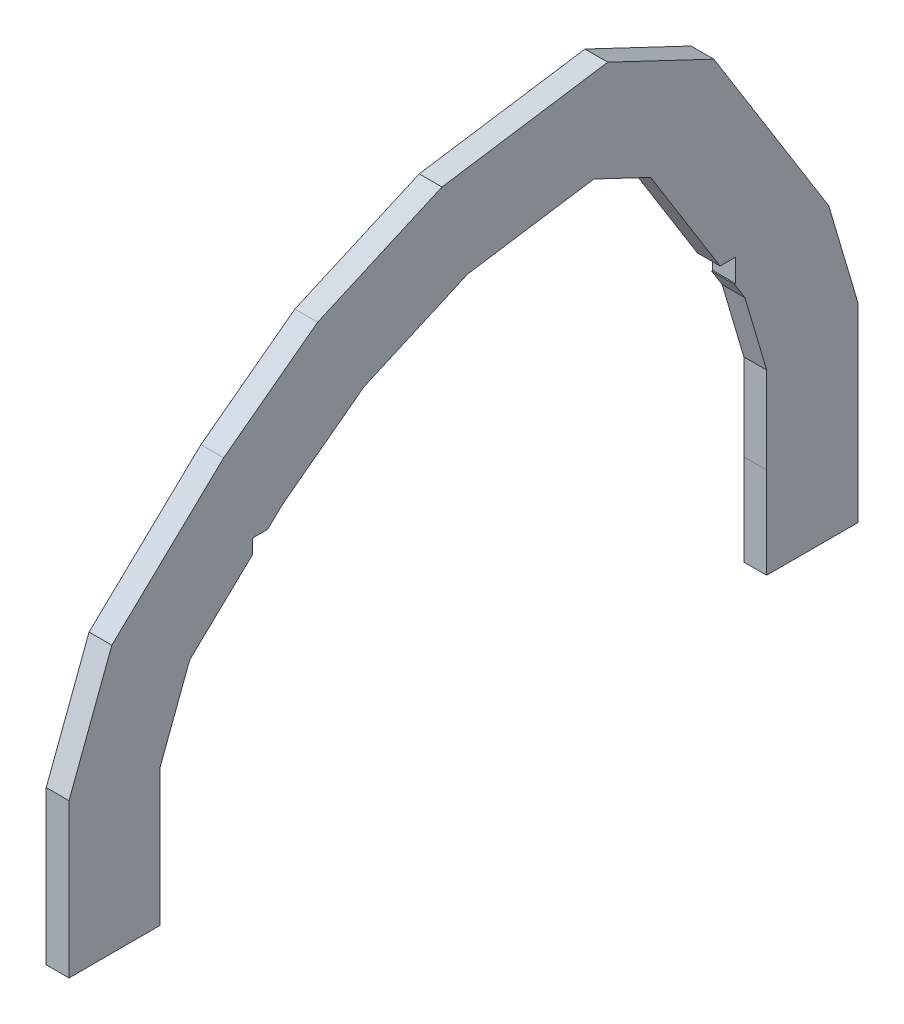
ISO-10303-21;
HEADER;
FILE_DESCRIPTION(('STEP AP214'),'2;1');
FILE_NAME('part.step','',(''),(''),'','','');
FILE_SCHEMA(('AUTOMOTIVE_DESIGN { 1 0 10303 214 1 1 1 1 }'));
ENDSEC;
DATA;
#1=APPLICATION_CONTEXT('core data for automotive mechanical design processes');
#2=APPLICATION_PROTOCOL_DEFINITION('international standard','automotive_design',2000,#1);
#3=PRODUCT_CONTEXT('',#1,'mechanical');
#4=PRODUCT('Part','Part','',(#3));
#5=PRODUCT_RELATED_PRODUCT_CATEGORY('part','',(#4));
#6=PRODUCT_DEFINITION_FORMATION('','',#4);
#7=PRODUCT_DEFINITION_CONTEXT('part definition',#1,'design');
#8=PRODUCT_DEFINITION('design','',#6,#7);
#9=PRODUCT_DEFINITION_SHAPE('','',#8);
#10=(LENGTH_UNIT() NAMED_UNIT(*) SI_UNIT(.MILLI.,.METRE.));
#11=(NAMED_UNIT(*) PLANE_ANGLE_UNIT() SI_UNIT($,.RADIAN.));
#12=(NAMED_UNIT(*) SI_UNIT($,.STERADIAN.) SOLID_ANGLE_UNIT());
#13=UNCERTAINTY_MEASURE_WITH_UNIT(LENGTH_MEASURE(1.E-05),#10,'distance_accuracy_value','');
#14=(GEOMETRIC_REPRESENTATION_CONTEXT(3) GLOBAL_UNCERTAINTY_ASSIGNED_CONTEXT((#13)) GLOBAL_UNIT_ASSIGNED_CONTEXT((#10,
#11,#12)) REPRESENTATION_CONTEXT('',''));
#15=CARTESIAN_POINT('',(0.,0.,0.));
#16=DIRECTION('',(0.,0.,1.));
#17=DIRECTION('',(1.,0.,0.));
#18=AXIS2_PLACEMENT_3D('',#15,#16,#17);
#19=CARTESIAN_POINT('',(-242.2525,21.7216118695721,-64.8763127778716));
#20=DIRECTION('',(0.,0.,1.));
#21=DIRECTION('',(0.,1.,0.));
#22=AXIS2_PLACEMENT_3D('',#19,#20,#21);
#23=PLANE('',#22);
#24=DIRECTION('',(0.,1.,0.));
#25=VECTOR('',#24,1.);
#26=CARTESIAN_POINT('',(-242.2525,21.7216118695721,-64.8763127778716));
#27=LINE('',#26,#25);
#28=CARTESIAN_POINT('',(-242.2525,21.7216118695721,-64.8763127778716));
#29=VERTEX_POINT('',#28);
#30=CARTESIAN_POINT('',(-242.2525,39.8318688402039,-64.8763127778719));
#31=VERTEX_POINT('',#30);
#32=EDGE_CURVE('E11',#29,#31,#27,.T.);
#33=ORIENTED_EDGE('',*,*,#32,.T.);
#34=DIRECTION('',(-1.,0.,0.));
#35=VECTOR('',#34,1.);
#36=CARTESIAN_POINT('',(-242.2525,39.8318688402039,-64.8763127778719));
#37=LINE('',#36,#35);
#38=CARTESIAN_POINT('',(-247.015,39.8318688402039,-64.8763127778719));
#39=VERTEX_POINT('',#38);
#40=EDGE_CURVE('E25',#31,#39,#37,.T.);
#41=ORIENTED_EDGE('',*,*,#40,.T.);
#42=DIRECTION('',(0.,1.,0.));
#43=VECTOR('',#42,1.);
#44=CARTESIAN_POINT('',(-247.015,21.7216118695721,-64.8763127778716));
#45=LINE('',#44,#43);
#46=CARTESIAN_POINT('',(-247.015,21.7216118695721,-64.8763127778716));
#47=VERTEX_POINT('',#46);
#48=EDGE_CURVE('E627',#47,#39,#45,.T.);
#49=ORIENTED_EDGE('',*,*,#48,.F.);
#50=DIRECTION('',(-1.,0.,0.));
#51=VECTOR('',#50,1.);
#52=CARTESIAN_POINT('',(-242.2525,21.7216118695721,-64.8763127778716));
#53=LINE('',#52,#51);
#54=EDGE_CURVE('E622',#29,#47,#53,.T.);
#55=ORIENTED_EDGE('',*,*,#54,.F.);
#56=EDGE_LOOP('',(#33,#41,#49,#55));
#57=FACE_BOUND('',#56,.T.);
#58=ADVANCED_FACE('F17',(#57),#23,.T.);
#59=CARTESIAN_POINT('',(-242.2525,39.8318688402039,-64.8763127778719));
#60=DIRECTION('',(0.,-0.283628441859663,0.958934255811242));
#61=DIRECTION('',(0.,0.958934255811242,0.283628441859663));
#62=AXIS2_PLACEMENT_3D('',#59,#60,#61);
#63=PLANE('',#62);
#64=DIRECTION('',(0.,0.958934255811242,0.283628441859663));
#65=VECTOR('',#64,1.);
#66=CARTESIAN_POINT('',(-242.2525,39.8318688402039,-64.8763127778719));
#67=LINE('',#66,#65);
#68=CARTESIAN_POINT('',(-242.2525,55.2187233128009,-60.3252713141457));
#69=VERTEX_POINT('',#68);
#70=EDGE_CURVE('E618',#31,#69,#67,.T.);
#71=ORIENTED_EDGE('',*,*,#70,.T.);
#72=DIRECTION('',(-1.,0.,0.));
#73=VECTOR('',#72,1.);
#74=CARTESIAN_POINT('',(-242.2525,55.2187233128009,-60.3252713141457));
#75=LINE('',#74,#73);
#76=CARTESIAN_POINT('',(-247.015,55.2187233128009,-60.3252713141457));
#77=VERTEX_POINT('',#76);
#78=EDGE_CURVE('E614',#69,#77,#75,.T.);
#79=ORIENTED_EDGE('',*,*,#78,.T.);
#80=DIRECTION('',(0.,0.958934255811242,0.283628441859663));
#81=VECTOR('',#80,1.);
#82=CARTESIAN_POINT('',(-247.015,39.8318688402039,-64.8763127778719));
#83=LINE('',#82,#81);
#84=EDGE_CURVE('E609',#39,#77,#83,.T.);
#85=ORIENTED_EDGE('',*,*,#84,.F.);
#86=ORIENTED_EDGE('',*,*,#40,.F.);
#87=EDGE_LOOP('',(#71,#79,#85,#86));
#88=FACE_BOUND('',#87,.T.);
#89=ADVANCED_FACE('F648',(#88),#63,.T.);
#90=CARTESIAN_POINT('',(-242.2525,86.8551251460985,-40.6098324904967));
#91=DIRECTION('',(0.,-0.903198661850357,0.429222759452158));
#92=DIRECTION('',(0.,0.429222759452158,0.903198661850357));
#93=AXIS2_PLACEMENT_3D('',#90,#91,#92);
#94=PLANE('',#93);
#95=DIRECTION('',(0.,0.429222759452158,0.903198661850357));
#96=VECTOR('',#95,1.);
#97=CARTESIAN_POINT('',(-242.2525,86.8551251460985,-40.6098324904967));
#98=LINE('',#97,#96);
#99=CARTESIAN_POINT('',(-242.2525,86.8551251460985,-40.6098324904967));
#100=VERTEX_POINT('',#99);
#101=CARTESIAN_POINT('',(-242.2525,92.4989777646315,-28.733667910487));
#102=VERTEX_POINT('',#101);
#103=EDGE_CURVE('E605',#100,#102,#98,.T.);
#104=ORIENTED_EDGE('',*,*,#103,.T.);
#105=DIRECTION('',(-1.,0.,0.));
#106=VECTOR('',#105,1.);
#107=CARTESIAN_POINT('',(-242.2525,92.4989777646315,-28.733667910487));
#108=LINE('',#107,#106);
#109=CARTESIAN_POINT('',(-247.015,92.4989777646315,-28.733667910487));
#110=VERTEX_POINT('',#109);
#111=EDGE_CURVE('E601',#102,#110,#108,.T.);
#112=ORIENTED_EDGE('',*,*,#111,.T.);
#113=DIRECTION('',(0.,0.429222759452158,0.903198661850357));
#114=VECTOR('',#113,1.);
#115=CARTESIAN_POINT('',(-247.015,86.8551251460985,-40.6098324904967));
#116=LINE('',#115,#114);
#117=CARTESIAN_POINT('',(-247.015,86.8551251460985,-40.6098324904967));
#118=VERTEX_POINT('',#117);
#119=EDGE_CURVE('E596',#118,#110,#116,.T.);
#120=ORIENTED_EDGE('',*,*,#119,.F.);
#121=DIRECTION('',(-1.,0.,0.));
#122=VECTOR('',#121,1.);
#123=CARTESIAN_POINT('',(-242.2525,86.8551251460985,-40.6098324904967));
#124=LINE('',#123,#122);
#125=EDGE_CURVE('E591',#100,#118,#124,.T.);
#126=ORIENTED_EDGE('',*,*,#125,.F.);
#127=EDGE_LOOP('',(#104,#112,#120,#126));
#128=FACE_BOUND('',#127,.T.);
#129=ADVANCED_FACE('F671',(#128),#94,.T.);
#130=CARTESIAN_POINT('',(-242.2525,92.4989777646315,-28.733667910487));
#131=DIRECTION('',(0.,-0.988632708021303,-0.150350818522763));
#132=DIRECTION('',(0.,-0.150350818522763,0.988632708021303));
#133=AXIS2_PLACEMENT_3D('',#130,#131,#132);
#134=PLANE('',#133);
#135=DIRECTION('',(0.,-0.150350818522763,0.988632708021303));
#136=VECTOR('',#135,1.);
#137=CARTESIAN_POINT('',(-242.2525,92.4989777646315,-28.733667910487));
#138=LINE('',#137,#136);
#139=CARTESIAN_POINT('',(-242.2525,88.4862440070625,-2.34791304535225));
#140=VERTEX_POINT('',#139);
#141=EDGE_CURVE('E587',#102,#140,#138,.T.);
#142=ORIENTED_EDGE('',*,*,#141,.T.);
#143=DIRECTION('',(-1.,0.,0.));
#144=VECTOR('',#143,1.);
#145=CARTESIAN_POINT('',(-242.2525,88.4862440070625,-2.34791304535225));
#146=LINE('',#145,#144);
#147=CARTESIAN_POINT('',(-247.015,88.4862440070625,-2.34791304535225));
#148=VERTEX_POINT('',#147);
#149=EDGE_CURVE('E583',#140,#148,#146,.T.);
#150=ORIENTED_EDGE('',*,*,#149,.T.);
#151=DIRECTION('',(0.,-0.150350818522763,0.988632708021303));
#152=VECTOR('',#151,1.);
#153=CARTESIAN_POINT('',(-247.015,92.4989777646315,-28.733667910487));
#154=LINE('',#153,#152);
#155=EDGE_CURVE('E578',#110,#148,#154,.T.);
#156=ORIENTED_EDGE('',*,*,#155,.F.);
#157=ORIENTED_EDGE('',*,*,#111,.F.);
#158=EDGE_LOOP('',(#142,#150,#156,#157));
#159=FACE_BOUND('',#158,.T.);
#160=ADVANCED_FACE('F675',(#159),#134,.T.);
#161=CARTESIAN_POINT('',(-242.2525,88.4862440070625,-2.34791304535225));
#162=DIRECTION('',(0.,-0.914750423770287,-0.404019383460843));
#163=DIRECTION('',(0.,-0.404019383460843,0.914750423770287));
#164=AXIS2_PLACEMENT_3D('',#161,#162,#163);
#165=PLANE('',#164);
#166=DIRECTION('',(0.,-0.404019383460843,0.914750423770287));
#167=VECTOR('',#166,1.);
#168=CARTESIAN_POINT('',(-242.2525,88.4862440070625,-2.34791304535225));
#169=LINE('',#168,#167);
#170=CARTESIAN_POINT('',(-242.2525,78.9085643907598,19.3371516975827));
#171=VERTEX_POINT('',#170);
#172=EDGE_CURVE('E574',#140,#171,#169,.T.);
#173=ORIENTED_EDGE('',*,*,#172,.T.);
#174=DIRECTION('',(-1.,0.,0.));
#175=VECTOR('',#174,1.);
#176=CARTESIAN_POINT('',(-242.2525,78.9085643907598,19.3371516975827));
#177=LINE('',#176,#175);
#178=CARTESIAN_POINT('',(-247.015,78.9085643907598,19.3371516975827));
#179=VERTEX_POINT('',#178);
#180=EDGE_CURVE('E570',#171,#179,#177,.T.);
#181=ORIENTED_EDGE('',*,*,#180,.T.);
#182=DIRECTION('',(0.,-0.404019383460843,0.914750423770287));
#183=VECTOR('',#182,1.);
#184=CARTESIAN_POINT('',(-247.015,88.4862440070625,-2.34791304535225));
#185=LINE('',#184,#183);
#186=EDGE_CURVE('E565',#148,#179,#185,.T.);
#187=ORIENTED_EDGE('',*,*,#186,.F.);
#188=ORIENTED_EDGE('',*,*,#149,.F.);
#189=EDGE_LOOP('',(#173,#181,#187,#188));
#190=FACE_BOUND('',#189,.T.);
#191=ADVANCED_FACE('F681',(#190),#165,.T.);
#192=CARTESIAN_POINT('',(-242.2525,78.9085643907598,19.3371516975827));
#193=DIRECTION('',(0.,-0.8,-0.6));
#194=DIRECTION('',(0.,-0.6,0.8));
#195=AXIS2_PLACEMENT_3D('',#192,#193,#194);
#196=PLANE('',#195);
#197=DIRECTION('',(0.,-0.6,0.8));
#198=VECTOR('',#197,1.);
#199=CARTESIAN_POINT('',(-242.2525,78.9085643907598,19.3371516975827));
#200=LINE('',#199,#198);
#201=CARTESIAN_POINT('',(-242.2525,66.1491293884108,36.3497317007145));
#202=VERTEX_POINT('',#201);
#203=EDGE_CURVE('E561',#171,#202,#200,.T.);
#204=ORIENTED_EDGE('',*,*,#203,.T.);
#205=DIRECTION('',(-1.,0.,0.));
#206=VECTOR('',#205,1.);
#207=CARTESIAN_POINT('',(-242.2525,66.1491293884108,36.3497317007145));
#208=LINE('',#207,#206);
#209=CARTESIAN_POINT('',(-247.015,66.1491293884108,36.3497317007145));
#210=VERTEX_POINT('',#209);
#211=EDGE_CURVE('E557',#202,#210,#208,.T.);
#212=ORIENTED_EDGE('',*,*,#211,.T.);
#213=DIRECTION('',(0.,-0.6,0.8));
#214=VECTOR('',#213,1.);
#215=CARTESIAN_POINT('',(-247.015,78.9085643907598,19.3371516975827));
#216=LINE('',#215,#214);
#217=EDGE_CURVE('E552',#179,#210,#216,.T.);
#218=ORIENTED_EDGE('',*,*,#217,.F.);
#219=ORIENTED_EDGE('',*,*,#180,.F.);
#220=EDGE_LOOP('',(#204,#212,#218,#219));
#221=FACE_BOUND('',#220,.T.);
#222=ADVANCED_FACE('F685',(#221),#196,.T.);
#223=CARTESIAN_POINT('',(-242.2525,47.6703951341775,55.7884002019211));
#224=DIRECTION('',(0.,-0.353622392329075,-0.935388263580136));
#225=DIRECTION('',(0.,-0.935388263580136,0.353622392329075));
#226=AXIS2_PLACEMENT_3D('',#223,#224,#225);
#227=PLANE('',#226);
#228=DIRECTION('',(0.,-0.935388263580136,0.353622392329075));
#229=VECTOR('',#228,1.);
#230=CARTESIAN_POINT('',(-242.2525,47.6703951341775,55.7884002019211));
#231=LINE('',#230,#229);
#232=CARTESIAN_POINT('',(-242.2525,47.6703951341775,55.7884002019211));
#233=VERTEX_POINT('',#232);
#234=CARTESIAN_POINT('',(-242.2525,31.3096314557018,61.9735669584178));
#235=VERTEX_POINT('',#234);
#236=EDGE_CURVE('E548',#233,#235,#231,.T.);
#237=ORIENTED_EDGE('',*,*,#236,.T.);
#238=DIRECTION('',(-1.,0.,0.));
#239=VECTOR('',#238,1.);
#240=CARTESIAN_POINT('',(-242.2525,31.3096314557018,61.9735669584178));
#241=LINE('',#240,#239);
#242=CARTESIAN_POINT('',(-247.015,31.3096314557018,61.9735669584178));
#243=VERTEX_POINT('',#242);
#244=EDGE_CURVE('E544',#235,#243,#241,.T.);
#245=ORIENTED_EDGE('',*,*,#244,.T.);
#246=DIRECTION('',(0.,-0.935388263580136,0.353622392329075));
#247=VECTOR('',#246,1.);
#248=CARTESIAN_POINT('',(-247.015,47.6703951341775,55.7884002019211));
#249=LINE('',#248,#247);
#250=CARTESIAN_POINT('',(-247.015,47.6703951341775,55.7884002019211));
#251=VERTEX_POINT('',#250);
#252=EDGE_CURVE('E539',#251,#243,#249,.T.);
#253=ORIENTED_EDGE('',*,*,#252,.F.);
#254=DIRECTION('',(-1.,0.,0.));
#255=VECTOR('',#254,1.);
#256=CARTESIAN_POINT('',(-242.2525,47.6703951341775,55.7884002019211));
#257=LINE('',#256,#255);
#258=EDGE_CURVE('E534',#233,#251,#257,.T.);
#259=ORIENTED_EDGE('',*,*,#258,.F.);
#260=EDGE_LOOP('',(#237,#245,#253,#259));
#261=FACE_BOUND('',#260,.T.);
#262=ADVANCED_FACE('F689',(#261),#227,.T.);
#263=CARTESIAN_POINT('',(-242.2525,31.3096314557018,61.9735669584178));
#264=DIRECTION('',(0.,0.,-1.));
#265=DIRECTION('',(0.,-1.,0.));
#266=AXIS2_PLACEMENT_3D('',#263,#264,#265);
#267=PLANE('',#266);
#268=DIRECTION('',(0.,-1.,0.));
#269=VECTOR('',#268,1.);
#270=CARTESIAN_POINT('',(-242.2525,31.3096314557018,61.9735669584178));
#271=LINE('',#270,#269);
#272=CARTESIAN_POINT('',(-242.2525,21.7303834460125,61.9735669584178));
#273=VERTEX_POINT('',#272);
#274=EDGE_CURVE('E530',#235,#273,#271,.T.);
#275=ORIENTED_EDGE('',*,*,#274,.T.);
#276=DIRECTION('',(-1.,0.,0.));
#277=VECTOR('',#276,1.);
#278=CARTESIAN_POINT('',(-242.2525,21.7303834460125,61.9735669584178));
#279=LINE('',#278,#277);
#280=CARTESIAN_POINT('',(-247.015,21.7303834460125,61.9735669584178));
#281=VERTEX_POINT('',#280);
#282=EDGE_CURVE('E526',#273,#281,#279,.T.);
#283=ORIENTED_EDGE('',*,*,#282,.T.);
#284=DIRECTION('',(0.,-1.,0.));
#285=VECTOR('',#284,1.);
#286=CARTESIAN_POINT('',(-247.015,31.3096314557018,61.9735669584178));
#287=LINE('',#286,#285);
#288=EDGE_CURVE('E521',#243,#281,#287,.T.);
#289=ORIENTED_EDGE('',*,*,#288,.F.);
#290=ORIENTED_EDGE('',*,*,#244,.F.);
#291=EDGE_LOOP('',(#275,#283,#289,#290));
#292=FACE_BOUND('',#291,.T.);
#293=ADVANCED_FACE('F693',(#292),#267,.T.);
#294=CARTESIAN_POINT('',(-242.2525,21.7303834460125,61.9735669584178));
#295=DIRECTION('',(0.,-6.91492687073141E-05,-0.999999997609189));
#296=DIRECTION('',(0.,-0.999999997609189,6.91492687073141E-05));
#297=AXIS2_PLACEMENT_3D('',#294,#295,#296);
#298=PLANE('',#297);
#299=DIRECTION('',(0.,-0.999999997609189,6.91492687073141E-05));
#300=VECTOR('',#299,1.);
#301=CARTESIAN_POINT('',(-242.2525,21.7303834460125,61.9735669584178));
#302=LINE('',#301,#300);
#303=CARTESIAN_POINT('',(-242.2525,2.68038349155748,61.9748842519867));
#304=VERTEX_POINT('',#303);
#305=EDGE_CURVE('E519',#273,#304,#302,.T.);
#306=ORIENTED_EDGE('',*,*,#305,.T.);
#307=DIRECTION('',(-1.,0.,0.));
#308=VECTOR('',#307,1.);
#309=CARTESIAN_POINT('',(-242.2525,2.68038349155748,61.9748842519867));
#310=LINE('',#309,#308);
#311=CARTESIAN_POINT('',(-247.015,2.68038349155748,61.9748842519867));
#312=VERTEX_POINT('',#311);
#313=EDGE_CURVE('E515',#304,#312,#310,.T.);
#314=ORIENTED_EDGE('',*,*,#313,.T.);
#315=DIRECTION('',(0.,-0.999999997609189,6.91492687073141E-05));
#316=VECTOR('',#315,1.);
#317=CARTESIAN_POINT('',(-247.015,21.7303834460125,61.9735669584178));
#318=LINE('',#317,#316);
#319=EDGE_CURVE('E512',#281,#312,#318,.T.);
#320=ORIENTED_EDGE('',*,*,#319,.F.);
#321=ORIENTED_EDGE('',*,*,#282,.F.);
#322=EDGE_LOOP('',(#306,#314,#320,#321));
#323=FACE_BOUND('',#322,.T.);
#324=ADVANCED_FACE('F697',(#323),#298,.T.);
#325=CARTESIAN_POINT('',(-242.2525,2.67029453045518,-83.9263127778719));
#326=DIRECTION('',(0.,-0.999999997609189,6.9149268707677E-05));
#327=DIRECTION('',(0.,6.9149268707677E-05,0.999999997609189));
#328=AXIS2_PLACEMENT_3D('',#325,#326,#327);
#329=PLANE('',#328);
#330=DIRECTION('',(0.,-6.9149268707677E-05,-0.999999997609189));
#331=VECTOR('',#330,1.);
#332=CARTESIAN_POINT('',(-242.2525,2.67599787410856,-1.44758601263741));
#333=LINE('',#332,#331);
#334=CARTESIAN_POINT('',(-242.2525,2.68170069403962,81.0235669584178));
#335=VERTEX_POINT('',#334);
#336=EDGE_CURVE('E509',#335,#304,#333,.T.);
#337=ORIENTED_EDGE('',*,*,#336,.F.);
#338=DIRECTION('',(-1.,0.,0.));
#339=VECTOR('',#338,1.);
#340=CARTESIAN_POINT('',(-242.2525,2.68170069403962,81.0235669584178));
#341=LINE('',#340,#339);
#342=CARTESIAN_POINT('',(-247.015,2.68170069403962,81.0235669584178));
#343=VERTEX_POINT('',#342);
#344=EDGE_CURVE('E507',#335,#343,#341,.T.);
#345=ORIENTED_EDGE('',*,*,#344,.T.);
#346=DIRECTION('',(0.,6.9149268707677E-05,0.999999997609189));
#347=VECTOR('',#346,1.);
#348=CARTESIAN_POINT('',(-247.015,2.67599787410856,-1.44758601263741));
#349=LINE('',#348,#347);
#350=EDGE_CURVE('E502',#312,#343,#349,.T.);
#351=ORIENTED_EDGE('',*,*,#350,.F.);
#352=ORIENTED_EDGE('',*,*,#313,.F.);
#353=EDGE_LOOP('',(#337,#345,#351,#352));
#354=FACE_BOUND('',#353,.T.);
#355=ADVANCED_FACE('F701',(#354),#329,.T.);
#356=CARTESIAN_POINT('',(-242.2525,2.68170069403962,81.0235669584178));
#357=DIRECTION('',(0.,0.,1.));
#358=DIRECTION('',(0.,1.,0.));
#359=AXIS2_PLACEMENT_3D('',#356,#357,#358);
#360=PLANE('',#359);
#361=DIRECTION('',(0.,-1.,0.));
#362=VECTOR('',#361,1.);
#363=CARTESIAN_POINT('',(-242.2525,10.8133790426224,81.0235669584178));
#364=LINE('',#363,#362);
#365=CARTESIAN_POINT('',(-242.2525,34.7903317888782,81.0235669584178));
#366=VERTEX_POINT('',#365);
#367=EDGE_CURVE('E497',#366,#335,#364,.T.);
#368=ORIENTED_EDGE('',*,*,#367,.F.);
#369=DIRECTION('',(-1.,0.,0.));
#370=VECTOR('',#369,1.);
#371=CARTESIAN_POINT('',(-242.2525,34.7903317888782,81.0235669584178));
#372=LINE('',#371,#370);
#373=CARTESIAN_POINT('',(-247.015,34.7903317888782,81.0235669584178));
#374=VERTEX_POINT('',#373);
#375=EDGE_CURVE('E493',#366,#374,#372,.T.);
#376=ORIENTED_EDGE('',*,*,#375,.T.);
#377=DIRECTION('',(0.,1.,0.));
#378=VECTOR('',#377,1.);
#379=CARTESIAN_POINT('',(-247.015,10.8133790426224,81.0235669584178));
#380=LINE('',#379,#378);
#381=EDGE_CURVE('E488',#343,#374,#380,.T.);
#382=ORIENTED_EDGE('',*,*,#381,.F.);
#383=ORIENTED_EDGE('',*,*,#344,.F.);
#384=EDGE_LOOP('',(#368,#376,#382,#383));
#385=FACE_BOUND('',#384,.T.);
#386=ADVANCED_FACE('F708',(#385),#360,.T.);
#387=CARTESIAN_POINT('',(-242.2525,34.7903317888782,81.0235669584178));
#388=DIRECTION('',(0.,0.353622392329075,0.935388263580136));
#389=DIRECTION('',(0.,0.935388263580136,-0.353622392329075));
#390=AXIS2_PLACEMENT_3D('',#387,#388,#389);
#391=PLANE('',#390);
#392=DIRECTION('',(0.,-0.935388263580136,0.353622392329075));
#393=VECTOR('',#392,1.);
#394=CARTESIAN_POINT('',(-242.2525,58.4784055863839,72.0683195471659));
#395=LINE('',#394,#393);
#396=CARTESIAN_POINT('',(-242.2525,58.4784055863839,72.0683195471659));
#397=VERTEX_POINT('',#396);
#398=EDGE_CURVE('E483',#397,#366,#395,.T.);
#399=ORIENTED_EDGE('',*,*,#398,.F.);
#400=DIRECTION('',(-1.,0.,0.));
#401=VECTOR('',#400,1.);
#402=CARTESIAN_POINT('',(-242.2525,58.4784055863839,72.0683195471659));
#403=LINE('',#402,#401);
#404=CARTESIAN_POINT('',(-247.015,58.4784055863839,72.0683195471659));
#405=VERTEX_POINT('',#404);
#406=EDGE_CURVE('E479',#397,#405,#403,.T.);
#407=ORIENTED_EDGE('',*,*,#406,.T.);
#408=DIRECTION('',(0.,0.935388263580136,-0.353622392329075));
#409=VECTOR('',#408,1.);
#410=CARTESIAN_POINT('',(-247.015,58.4784055863839,72.0683195471659));
#411=LINE('',#410,#409);
#412=EDGE_CURVE('E474',#374,#405,#411,.T.);
#413=ORIENTED_EDGE('',*,*,#412,.F.);
#414=ORIENTED_EDGE('',*,*,#375,.F.);
#415=EDGE_LOOP('',(#399,#407,#413,#414));
#416=FACE_BOUND('',#415,.T.);
#417=ADVANCED_FACE('F711',(#416),#391,.T.);
#418=CARTESIAN_POINT('',(-242.2525,58.4784055863839,72.0683195471659));
#419=DIRECTION('',(0.,0.724775993112461,0.688984586045179));
#420=DIRECTION('',(0.,0.688984586045179,-0.72477599311246));
#421=AXIS2_PLACEMENT_3D('',#418,#419,#420);
#422=PLANE('',#421);
#423=DIRECTION('',(0.,-0.688984586045179,0.72477599311246));
#424=VECTOR('',#423,1.);
#425=CARTESIAN_POINT('',(-242.2525,80.7220846401393,48.6691246984101));
#426=LINE('',#425,#424);
#427=CARTESIAN_POINT('',(-242.2525,80.7220846401393,48.6691246984101));
#428=VERTEX_POINT('',#427);
#429=EDGE_CURVE('E469',#428,#397,#426,.T.);
#430=ORIENTED_EDGE('',*,*,#429,.F.);
#431=DIRECTION('',(-1.,0.,0.));
#432=VECTOR('',#431,1.);
#433=CARTESIAN_POINT('',(-242.2525,80.7220846401393,48.6691246984101));
#434=LINE('',#433,#432);
#435=CARTESIAN_POINT('',(-247.015,80.7220846401393,48.6691246984101));
#436=VERTEX_POINT('',#435);
#437=EDGE_CURVE('E465',#428,#436,#434,.T.);
#438=ORIENTED_EDGE('',*,*,#437,.T.);
#439=DIRECTION('',(0.,0.688984586045179,-0.72477599311246));
#440=VECTOR('',#439,1.);
#441=CARTESIAN_POINT('',(-247.015,80.7220846401393,48.6691246984101));
#442=LINE('',#441,#440);
#443=EDGE_CURVE('E460',#405,#436,#442,.T.);
#444=ORIENTED_EDGE('',*,*,#443,.F.);
#445=ORIENTED_EDGE('',*,*,#406,.F.);
#446=EDGE_LOOP('',(#430,#438,#444,#445));
#447=FACE_BOUND('',#446,.T.);
#448=ADVANCED_FACE('F715',(#447),#422,.T.);
#449=CARTESIAN_POINT('',(-242.2525,80.7220846401393,48.6691246984101));
#450=DIRECTION('',(0.,0.8,0.6));
#451=DIRECTION('',(0.,0.6,-0.8));
#452=AXIS2_PLACEMENT_3D('',#449,#450,#451);
#453=PLANE('',#452);
#454=DIRECTION('',(0.,-0.6,0.8));
#455=VECTOR('',#454,1.);
#456=CARTESIAN_POINT('',(-242.2525,95.4549110263928,29.0253561834054));
#457=LINE('',#456,#455);
#458=CARTESIAN_POINT('',(-242.2525,95.4549110263928,29.0253561834054));
#459=VERTEX_POINT('',#458);
#460=EDGE_CURVE('E455',#459,#428,#457,.T.);
#461=ORIENTED_EDGE('',*,*,#460,.F.);
#462=DIRECTION('',(-1.,0.,0.));
#463=VECTOR('',#462,1.);
#464=CARTESIAN_POINT('',(-242.2525,95.4549110263928,29.0253561834054));
#465=LINE('',#464,#463);
#466=CARTESIAN_POINT('',(-247.015,95.4549110263928,29.0253561834054));
#467=VERTEX_POINT('',#466);
#468=EDGE_CURVE('E451',#459,#467,#465,.T.);
#469=ORIENTED_EDGE('',*,*,#468,.T.);
#470=DIRECTION('',(0.,0.6,-0.8));
#471=VECTOR('',#470,1.);
#472=CARTESIAN_POINT('',(-247.015,95.4549110263928,29.0253561834054));
#473=LINE('',#472,#471);
#474=EDGE_CURVE('E446',#436,#467,#473,.T.);
#475=ORIENTED_EDGE('',*,*,#474,.F.);
#476=ORIENTED_EDGE('',*,*,#437,.F.);
#477=EDGE_LOOP('',(#461,#469,#475,#476));
#478=FACE_BOUND('',#477,.T.);
#479=ADVANCED_FACE('F719',(#478),#453,.T.);
#480=CARTESIAN_POINT('',(-242.2525,95.4549110263928,29.0253561834054));
#481=DIRECTION('',(0.,0.914750423770287,0.404019383460843));
#482=DIRECTION('',(0.,0.404019383460843,-0.914750423770287));
#483=AXIS2_PLACEMENT_3D('',#480,#481,#482);
#484=PLANE('',#483);
#485=DIRECTION('',(0.,-0.404019383460843,0.914750423770287));
#486=VECTOR('',#485,1.);
#487=CARTESIAN_POINT('',(-242.2525,106.93798034917,3.02625079589916));
#488=LINE('',#487,#486);
#489=CARTESIAN_POINT('',(-242.2525,106.93798034917,3.02625079589916));
#490=VERTEX_POINT('',#489);
#491=EDGE_CURVE('E441',#490,#459,#488,.T.);
#492=ORIENTED_EDGE('',*,*,#491,.F.);
#493=DIRECTION('',(-1.,0.,0.));
#494=VECTOR('',#493,1.);
#495=CARTESIAN_POINT('',(-242.2525,106.93798034917,3.02625079589916));
#496=LINE('',#495,#494);
#497=CARTESIAN_POINT('',(-247.015,106.93798034917,3.02625079589916));
#498=VERTEX_POINT('',#497);
#499=EDGE_CURVE('E437',#490,#498,#496,.T.);
#500=ORIENTED_EDGE('',*,*,#499,.T.);
#501=DIRECTION('',(0.,0.404019383460843,-0.914750423770287));
#502=VECTOR('',#501,1.);
#503=CARTESIAN_POINT('',(-247.015,106.93798034917,3.02625079589916));
#504=LINE('',#503,#502);
#505=EDGE_CURVE('E432',#467,#498,#504,.T.);
#506=ORIENTED_EDGE('',*,*,#505,.F.);
#507=ORIENTED_EDGE('',*,*,#468,.F.);
#508=EDGE_LOOP('',(#492,#500,#506,#507));
#509=FACE_BOUND('',#508,.T.);
#510=ADVANCED_FACE('F723',(#509),#484,.T.);
#511=CARTESIAN_POINT('',(-242.2525,106.93798034917,3.02625079589916));
#512=DIRECTION('',(0.,0.988632708021303,0.150350818522763));
#513=DIRECTION('',(0.,0.150350818522763,-0.988632708021303));
#514=AXIS2_PLACEMENT_3D('',#511,#512,#513);
#515=PLANE('',#514);
#516=DIRECTION('',(0.,-0.150350818522763,0.988632708021303));
#517=VECTOR('',#516,1.);
#518=CARTESIAN_POINT('',(-242.2525,112.209890053897,-31.6392230541091));
#519=LINE('',#518,#517);
#520=CARTESIAN_POINT('',(-242.2525,112.209890053897,-31.6392230541091));
#521=VERTEX_POINT('',#520);
#522=EDGE_CURVE('E427',#521,#490,#519,.T.);
#523=ORIENTED_EDGE('',*,*,#522,.F.);
#524=DIRECTION('',(-1.,0.,0.));
#525=VECTOR('',#524,1.);
#526=CARTESIAN_POINT('',(-242.2525,112.209890053897,-31.6392230541091));
#527=LINE('',#526,#525);
#528=CARTESIAN_POINT('',(-247.015,112.209890053897,-31.6392230541091));
#529=VERTEX_POINT('',#528);
#530=EDGE_CURVE('E423',#521,#529,#527,.T.);
#531=ORIENTED_EDGE('',*,*,#530,.T.);
#532=DIRECTION('',(0.,0.150350818522763,-0.988632708021303));
#533=VECTOR('',#532,1.);
#534=CARTESIAN_POINT('',(-247.015,112.209890053897,-31.6392230541091));
#535=LINE('',#534,#533);
#536=EDGE_CURVE('E418',#498,#529,#535,.T.);
#537=ORIENTED_EDGE('',*,*,#536,.F.);
#538=ORIENTED_EDGE('',*,*,#499,.F.);
#539=EDGE_LOOP('',(#523,#531,#537,#538));
#540=FACE_BOUND('',#539,.T.);
#541=ADVANCED_FACE('F727',(#540),#515,.T.);
#542=CARTESIAN_POINT('',(-242.2525,112.209890053897,-31.6392230541091));
#543=DIRECTION('',(0.,0.903198661850357,-0.429222759452158));
#544=DIRECTION('',(0.,-0.429222759452158,-0.903198661850357));
#545=AXIS2_PLACEMENT_3D('',#542,#543,#544);
#546=PLANE('',#545);
#547=DIRECTION('',(0.,0.429222759452158,0.903198661850357));
#548=VECTOR('',#547,1.);
#549=CARTESIAN_POINT('',(-242.2525,101.666070644442,-53.8262189011279));
#550=LINE('',#549,#548);
#551=CARTESIAN_POINT('',(-242.2525,101.666070644442,-53.8262189011279));
#552=VERTEX_POINT('',#551);
#553=EDGE_CURVE('E413',#552,#521,#550,.T.);
#554=ORIENTED_EDGE('',*,*,#553,.F.);
#555=DIRECTION('',(-1.,0.,0.));
#556=VECTOR('',#555,1.);
#557=CARTESIAN_POINT('',(-242.2525,101.666070644442,-53.8262189011279));
#558=LINE('',#557,#556);
#559=CARTESIAN_POINT('',(-247.015,101.666070644442,-53.8262189011279));
#560=VERTEX_POINT('',#559);
#561=EDGE_CURVE('E409',#552,#560,#558,.T.);
#562=ORIENTED_EDGE('',*,*,#561,.T.);
#563=DIRECTION('',(0.,-0.429222759452158,-0.903198661850357));
#564=VECTOR('',#563,1.);
#565=CARTESIAN_POINT('',(-247.015,101.666070644442,-53.8262189011279));
#566=LINE('',#565,#564);
#567=EDGE_CURVE('E404',#529,#560,#566,.T.);
#568=ORIENTED_EDGE('',*,*,#567,.F.);
#569=ORIENTED_EDGE('',*,*,#530,.F.);
#570=EDGE_LOOP('',(#554,#562,#568,#569));
#571=FACE_BOUND('',#570,.T.);
#572=ADVANCED_FACE('F731',(#571),#546,.T.);
#573=CARTESIAN_POINT('',(-242.2525,101.666070644442,-53.8262189011279));
#574=DIRECTION('',(0.,0.528892886438516,-0.848688585215293));
#575=DIRECTION('',(0.,-0.848688585215293,-0.528892886438516));
#576=AXIS2_PLACEMENT_3D('',#573,#574,#575);
#577=PLANE('',#576);
#578=DIRECTION('',(0.,0.848688585215293,0.528892886438516));
#579=VECTOR('',#578,1.);
#580=CARTESIAN_POINT('',(-242.2525,83.0331162301397,-65.4380600578673));
#581=LINE('',#580,#579);
#582=CARTESIAN_POINT('',(-242.2525,63.1004687663849,-77.8598548541203));
#583=VERTEX_POINT('',#582);
#584=EDGE_CURVE('E399',#583,#552,#581,.T.);
#585=ORIENTED_EDGE('',*,*,#584,.F.);
#586=DIRECTION('',(-1.,0.,0.));
#587=VECTOR('',#586,1.);
#588=CARTESIAN_POINT('',(-242.2525,63.1004687663849,-77.8598548541203));
#589=LINE('',#588,#587);
#590=CARTESIAN_POINT('',(-247.015,63.1004687663849,-77.8598548541203));
#591=VERTEX_POINT('',#590);
#592=EDGE_CURVE('E395',#583,#591,#589,.T.);
#593=ORIENTED_EDGE('',*,*,#592,.T.);
#594=DIRECTION('',(0.,-0.848688585215293,-0.528892886438516));
#595=VECTOR('',#594,1.);
#596=CARTESIAN_POINT('',(-247.015,83.0331162301397,-65.4380600578673));
#597=LINE('',#596,#595);
#598=EDGE_CURVE('E390',#560,#591,#597,.T.);
#599=ORIENTED_EDGE('',*,*,#598,.F.);
#600=ORIENTED_EDGE('',*,*,#561,.F.);
#601=EDGE_LOOP('',(#585,#593,#599,#600));
#602=FACE_BOUND('',#601,.T.);
#603=ADVANCED_FACE('F735',(#602),#577,.T.);
#604=CARTESIAN_POINT('',(-242.2525,63.1004687663849,-77.8598548541203));
#605=DIRECTION('',(0.,0.283628441859663,-0.958934255811242));
#606=DIRECTION('',(0.,-0.958934255811242,-0.283628441859663));
#607=AXIS2_PLACEMENT_3D('',#604,#605,#606);
#608=PLANE('',#607);
#609=DIRECTION('',(0.,0.958934255811242,0.283628441859663));
#610=VECTOR('',#609,1.);
#611=CARTESIAN_POINT('',(-242.2525,42.5900634051301,-83.9263127778719));
#612=LINE('',#611,#610);
#613=CARTESIAN_POINT('',(-242.2525,42.5900634051301,-83.9263127778719));
#614=VERTEX_POINT('',#613);
#615=EDGE_CURVE('E385',#614,#583,#612,.T.);
#616=ORIENTED_EDGE('',*,*,#615,.F.);
#617=DIRECTION('',(-1.,0.,0.));
#618=VECTOR('',#617,1.);
#619=CARTESIAN_POINT('',(-242.2525,42.5900634051301,-83.9263127778719));
#620=LINE('',#619,#618);
#621=CARTESIAN_POINT('',(-247.015,42.5900634051301,-83.9263127778719));
#622=VERTEX_POINT('',#621);
#623=EDGE_CURVE('E381',#614,#622,#620,.T.);
#624=ORIENTED_EDGE('',*,*,#623,.T.);
#625=DIRECTION('',(0.,-0.958934255811242,-0.283628441859663));
#626=VECTOR('',#625,1.);
#627=CARTESIAN_POINT('',(-247.015,42.5900634051301,-83.9263127778719));
#628=LINE('',#627,#626);
#629=EDGE_CURVE('E376',#591,#622,#628,.T.);
#630=ORIENTED_EDGE('',*,*,#629,.F.);
#631=ORIENTED_EDGE('',*,*,#592,.F.);
#632=EDGE_LOOP('',(#616,#624,#630,#631));
#633=FACE_BOUND('',#632,.T.);
#634=ADVANCED_FACE('F739',(#633),#608,.T.);
#635=CARTESIAN_POINT('',(-242.2525,42.5900634051301,-83.9263127778719));
#636=DIRECTION('',(0.,0.,-1.));
#637=DIRECTION('',(0.,-1.,0.));
#638=AXIS2_PLACEMENT_3D('',#635,#636,#637);
#639=PLANE('',#638);
#640=DIRECTION('',(0.,1.,0.));
#641=VECTOR('',#640,1.);
#642=CARTESIAN_POINT('',(-242.2525,2.67029453045518,-83.9263127778719));
#643=LINE('',#642,#641);
#644=CARTESIAN_POINT('',(-242.2525,2.67029453045518,-83.9263127778719));
#645=VERTEX_POINT('',#644);
#646=EDGE_CURVE('E371',#645,#614,#643,.T.);
#647=ORIENTED_EDGE('',*,*,#646,.F.);
#648=DIRECTION('',(-1.,0.,0.));
#649=VECTOR('',#648,1.);
#650=CARTESIAN_POINT('',(-242.2525,2.67029453045518,-83.9263127778719));
#651=LINE('',#650,#649);
#652=CARTESIAN_POINT('',(-247.015,2.67029453045518,-83.9263127778719));
#653=VERTEX_POINT('',#652);
#654=EDGE_CURVE('E367',#645,#653,#651,.T.);
#655=ORIENTED_EDGE('',*,*,#654,.T.);
#656=DIRECTION('',(0.,-1.,0.));
#657=VECTOR('',#656,1.);
#658=CARTESIAN_POINT('',(-247.015,2.67029453045518,-83.9263127778719));
#659=LINE('',#658,#657);
#660=EDGE_CURVE('E362',#622,#653,#659,.T.);
#661=ORIENTED_EDGE('',*,*,#660,.F.);
#662=ORIENTED_EDGE('',*,*,#623,.F.);
#663=EDGE_LOOP('',(#647,#655,#661,#662));
#664=FACE_BOUND('',#663,.T.);
#665=ADVANCED_FACE('F706',(#664),#639,.T.);
#666=DIRECTION('',(0.,-6.9149268707677E-05,-0.999999997609189));
#667=VECTOR('',#666,1.);
#668=CARTESIAN_POINT('',(-242.2525,2.68170069403962,81.0235669584178));
#669=LINE('',#668,#667);
#670=CARTESIAN_POINT('',(-242.2525,2.67161191511709,-64.8749954843027));
#671=VERTEX_POINT('',#670);
#672=EDGE_CURVE('E357',#671,#645,#669,.T.);
#673=ORIENTED_EDGE('',*,*,#672,.F.);
#674=DIRECTION('',(-1.,0.,0.));
#675=VECTOR('',#674,1.);
#676=CARTESIAN_POINT('',(-242.2525,2.67161191511709,-64.8749954843027));
#677=LINE('',#676,#675);
#678=CARTESIAN_POINT('',(-247.015,2.67161191511709,-64.8749954843027));
#679=VERTEX_POINT('',#678);
#680=EDGE_CURVE('E353',#671,#679,#677,.T.);
#681=ORIENTED_EDGE('',*,*,#680,.T.);
#682=DIRECTION('',(0.,6.9149268707677E-05,0.999999997609189));
#683=VECTOR('',#682,1.);
#684=CARTESIAN_POINT('',(-247.015,2.68170069403962,81.0235669584178));
#685=LINE('',#684,#683);
#686=EDGE_CURVE('E348',#653,#679,#685,.T.);
#687=ORIENTED_EDGE('',*,*,#686,.F.);
#688=ORIENTED_EDGE('',*,*,#654,.F.);
#689=EDGE_LOOP('',(#673,#681,#687,#688));
#690=FACE_BOUND('',#689,.T.);
#691=ADVANCED_FACE('F703',(#690),#329,.T.);
#692=CARTESIAN_POINT('',(-242.2525,2.67161191511709,-64.8749954843027));
#693=DIRECTION('',(0.,6.91492687077803E-05,0.999999997609189));
#694=DIRECTION('',(0.,0.999999997609189,-6.91492687077803E-05));
#695=AXIS2_PLACEMENT_3D('',#692,#693,#694);
#696=PLANE('',#695);
#697=DIRECTION('',(0.,-0.999999997609189,6.91492687077803E-05));
#698=VECTOR('',#697,1.);
#699=CARTESIAN_POINT('',(-242.2525,21.7216118695721,-64.8763127778716));
#700=LINE('',#699,#698);
#701=EDGE_CURVE('E343',#29,#671,#700,.T.);
#702=ORIENTED_EDGE('',*,*,#701,.F.);
#703=ORIENTED_EDGE('',*,*,#54,.T.);
#704=DIRECTION('',(0.,0.999999997609189,-6.91492687077803E-05));
#705=VECTOR('',#704,1.);
#706=CARTESIAN_POINT('',(-247.015,21.7216118695721,-64.8763127778716));
#707=LINE('',#706,#705);
#708=EDGE_CURVE('E338',#679,#47,#707,.T.);
#709=ORIENTED_EDGE('',*,*,#708,.F.);
#710=ORIENTED_EDGE('',*,*,#680,.F.);
#711=EDGE_LOOP('',(#702,#703,#709,#710));
#712=FACE_BOUND('',#711,.T.);
#713=ADVANCED_FACE('F642',(#712),#696,.T.);
#714=CARTESIAN_POINT('',(-247.015,57.440092292176,-1.45137290972691));
#715=DIRECTION('',(-1.,0.,0.));
#716=DIRECTION('',(0.,0.,1.));
#717=AXIS2_PLACEMENT_3D('',#714,#715,#716);
#718=PLANE('',#717);
#719=DIRECTION('',(0.,-0.00392946928861688,0.999992279605753));
#720=VECTOR('',#719,1.);
#721=CARTESIAN_POINT('',(-247.015,63.3253762411019,0.0438390090515553));
#722=LINE('',#721,#720);
#723=CARTESIAN_POINT('',(-247.015,63.5546899838494,-58.3131439604379));
#724=VERTEX_POINT('',#723);
#725=CARTESIAN_POINT('',(-247.015,63.542213918858,-55.1381684726899));
#726=VERTEX_POINT('',#725);
#727=EDGE_CURVE('E241',#724,#726,#722,.T.);
#728=ORIENTED_EDGE('',*,*,#727,.T.);
#729=DIRECTION('',(0.,0.848688585215293,0.528892886438516));
#730=VECTOR('',#729,1.);
#731=CARTESIAN_POINT('',(-247.015,55.2187233128009,-60.3252713141457));
#732=LINE('',#731,#730);
#733=EDGE_CURVE('E330',#726,#118,#732,.T.);
#734=ORIENTED_EDGE('',*,*,#733,.T.);
#735=ORIENTED_EDGE('',*,*,#119,.T.);
#736=ORIENTED_EDGE('',*,*,#155,.T.);
#737=ORIENTED_EDGE('',*,*,#186,.T.);
#738=ORIENTED_EDGE('',*,*,#217,.T.);
#739=DIRECTION('',(0.,-0.688984586045179,0.724775993112461));
#740=VECTOR('',#739,1.);
#741=CARTESIAN_POINT('',(-247.015,66.1491293884108,36.3497317007145));
#742=LINE('',#741,#740);
#743=CARTESIAN_POINT('',(-247.015,63.1703992827844,39.4832010326071));
#744=VERTEX_POINT('',#743);
#745=EDGE_CURVE('E326',#210,#744,#742,.T.);
#746=ORIENTED_EDGE('',*,*,#745,.T.);
#747=DIRECTION('',(0.,-0.00392946928861688,0.999992279605753));
#748=VECTOR('',#747,1.);
#749=CARTESIAN_POINT('',(-247.015,63.3253762411019,0.0438390090515553));
#750=LINE('',#749,#748);
#751=CARTESIAN_POINT('',(-247.015,63.1579232177932,42.6581765203555));
#752=VERTEX_POINT('',#751);
#753=EDGE_CURVE('E322',#744,#752,#750,.T.);
#754=ORIENTED_EDGE('',*,*,#753,.T.);
#755=DIRECTION('',(0.,-0.999992279605753,-0.0039294692886175));
#756=VECTOR('',#755,1.);
#757=CARTESIAN_POINT('',(-247.015,60.2123890078897,42.6466020447795));
#758=LINE('',#757,#756);
#759=CARTESIAN_POINT('',(-247.015,60.1633986057572,42.6464095370127));
#760=VERTEX_POINT('',#759);
#761=EDGE_CURVE('E318',#752,#760,#758,.T.);
#762=ORIENTED_EDGE('',*,*,#761,.T.);
#763=DIRECTION('',(0.,-0.688984586045179,0.724775993112461));
#764=VECTOR('',#763,1.);
#765=CARTESIAN_POINT('',(-247.015,66.1491293884108,36.3497317007145));
#766=LINE('',#765,#764);
#767=EDGE_CURVE('E313',#760,#251,#766,.T.);
#768=ORIENTED_EDGE('',*,*,#767,.T.);
#769=ORIENTED_EDGE('',*,*,#252,.T.);
#770=ORIENTED_EDGE('',*,*,#288,.T.);
#771=ORIENTED_EDGE('',*,*,#319,.T.);
#772=ORIENTED_EDGE('',*,*,#350,.T.);
#773=ORIENTED_EDGE('',*,*,#381,.T.);
#774=ORIENTED_EDGE('',*,*,#412,.T.);
#775=ORIENTED_EDGE('',*,*,#443,.T.);
#776=ORIENTED_EDGE('',*,*,#474,.T.);
#777=ORIENTED_EDGE('',*,*,#505,.T.);
#778=ORIENTED_EDGE('',*,*,#536,.T.);
#779=ORIENTED_EDGE('',*,*,#567,.T.);
#780=ORIENTED_EDGE('',*,*,#598,.T.);
#781=ORIENTED_EDGE('',*,*,#629,.T.);
#782=ORIENTED_EDGE('',*,*,#660,.T.);
#783=ORIENTED_EDGE('',*,*,#686,.T.);
#784=ORIENTED_EDGE('',*,*,#708,.T.);
#785=ORIENTED_EDGE('',*,*,#48,.T.);
#786=ORIENTED_EDGE('',*,*,#84,.T.);
#787=DIRECTION('',(0.,0.848688585215293,0.528892886438516));
#788=VECTOR('',#787,1.);
#789=CARTESIAN_POINT('',(-247.015,55.2187233128009,-60.3252713141457));
#790=LINE('',#789,#788);
#791=CARTESIAN_POINT('',(-247.015,58.7913112490565,-58.0988759335806));
#792=VERTEX_POINT('',#791);
#793=EDGE_CURVE('E309',#77,#792,#790,.T.);
#794=ORIENTED_EDGE('',*,*,#793,.T.);
#795=DIRECTION('',(0.,0.00392946928861688,-0.999992279605753));
#796=VECTOR('',#795,1.);
#797=CARTESIAN_POINT('',(-247.015,58.5629130094795,0.025124911564513));
#798=LINE('',#797,#796);
#799=CARTESIAN_POINT('',(-247.015,58.792226752227,-58.3318580579251));
#800=VERTEX_POINT('',#799);
#801=EDGE_CURVE('E305',#792,#800,#798,.T.);
#802=ORIENTED_EDGE('',*,*,#801,.T.);
#803=DIRECTION('',(0.,0.999992279605753,0.0039294692886175));
#804=VECTOR('',#803,1.);
#805=CARTESIAN_POINT('',(-247.015,60.6091557739461,-58.3247184360139));
#806=LINE('',#805,#804);
#807=EDGE_CURVE('E301',#800,#724,#806,.T.);
#808=ORIENTED_EDGE('',*,*,#807,.T.);
#809=EDGE_LOOP('',(#728,#734,#735,#736,#737,#738,#746,#754,#762,#768,#769,#770,#771,#772,#773,
#774,#775,#776,#777,#778,#779,#780,#781,#782,#783,#784,#785,#786,#794,#802,#808));
#810=FACE_BOUND('',#809,.T.);
#811=ADVANCED_FACE('F637',(#810),#718,.T.);
#812=CARTESIAN_POINT('',(-242.2525,66.1491293884108,36.3497317007145));
#813=DIRECTION('',(0.,-0.724775993112461,-0.688984586045179));
#814=DIRECTION('',(0.,-0.688984586045179,0.724775993112461));
#815=AXIS2_PLACEMENT_3D('',#812,#813,#814);
#816=PLANE('',#815);
#817=DIRECTION('',(-1.,0.,0.));
#818=VECTOR('',#817,1.);
#819=CARTESIAN_POINT('',(-121.139554556648,63.1703992827844,39.4832010326074));
#820=LINE('',#819,#818);
#821=CARTESIAN_POINT('',(-242.2525,63.1703992827844,39.4832010326071));
#822=VERTEX_POINT('',#821);
#823=EDGE_CURVE('E296',#822,#744,#820,.T.);
#824=ORIENTED_EDGE('',*,*,#823,.T.);
#825=ORIENTED_EDGE('',*,*,#745,.F.);
#826=ORIENTED_EDGE('',*,*,#211,.F.);
#827=DIRECTION('',(0.,-0.688984586045179,0.724775993112461));
#828=VECTOR('',#827,1.);
#829=CARTESIAN_POINT('',(-242.2525,66.1491293884108,36.3497317007145));
#830=LINE('',#829,#828);
#831=EDGE_CURVE('E292',#202,#822,#830,.T.);
#832=ORIENTED_EDGE('',*,*,#831,.T.);
#833=EDGE_LOOP('',(#824,#825,#826,#832));
#834=FACE_BOUND('',#833,.T.);
#835=ADVANCED_FACE('F751',(#834),#816,.T.);
#836=DIRECTION('',(1.,0.,0.));
#837=VECTOR('',#836,1.);
#838=CARTESIAN_POINT('',(-244.63375,60.1633986057572,42.6464095370127));
#839=LINE('',#838,#837);
#840=CARTESIAN_POINT('',(-242.2525,60.1633986057572,42.6464095370127));
#841=VERTEX_POINT('',#840);
#842=EDGE_CURVE('E288',#760,#841,#839,.T.);
#843=ORIENTED_EDGE('',*,*,#842,.T.);
#844=DIRECTION('',(0.,-0.688984586045179,0.724775993112461));
#845=VECTOR('',#844,1.);
#846=CARTESIAN_POINT('',(-242.2525,66.1491293884108,36.3497317007145));
#847=LINE('',#846,#845);
#848=EDGE_CURVE('E237',#841,#233,#847,.T.);
#849=ORIENTED_EDGE('',*,*,#848,.T.);
#850=ORIENTED_EDGE('',*,*,#258,.T.);
#851=ORIENTED_EDGE('',*,*,#767,.F.);
#852=EDGE_LOOP('',(#843,#849,#850,#851));
#853=FACE_BOUND('',#852,.T.);
#854=ADVANCED_FACE('F752',(#853),#816,.T.);
#855=CARTESIAN_POINT('',(-242.2525,57.440092292176,-1.45137290972691));
#856=DIRECTION('',(-1.,0.,0.));
#857=DIRECTION('',(0.,0.,1.));
#858=AXIS2_PLACEMENT_3D('',#855,#856,#857);
#859=PLANE('',#858);
#860=DIRECTION('',(0.,-0.999992279605753,-0.0039294692886175));
#861=VECTOR('',#860,1.);
#862=CARTESIAN_POINT('',(-242.2525,60.6091557739461,-58.3247184360139));
#863=LINE('',#862,#861);
#864=CARTESIAN_POINT('',(-242.2525,63.5546899838494,-58.3131439604379));
#865=VERTEX_POINT('',#864);
#866=CARTESIAN_POINT('',(-242.2525,58.792226752227,-58.3318580579251));
#867=VERTEX_POINT('',#866);
#868=EDGE_CURVE('E217',#865,#867,#863,.T.);
#869=ORIENTED_EDGE('',*,*,#868,.T.);
#870=DIRECTION('',(0.,-0.00392946928861688,0.999992279605753));
#871=VECTOR('',#870,1.);
#872=CARTESIAN_POINT('',(-242.2525,58.5629130094795,0.025124911564513));
#873=LINE('',#872,#871);
#874=CARTESIAN_POINT('',(-242.2525,58.7913112490565,-58.0988759335806));
#875=VERTEX_POINT('',#874);
#876=EDGE_CURVE('E238',#867,#875,#873,.T.);
#877=ORIENTED_EDGE('',*,*,#876,.T.);
#878=DIRECTION('',(0.,0.848688585215293,0.528892886438516));
#879=VECTOR('',#878,1.);
#880=CARTESIAN_POINT('',(-242.2525,55.2187233128009,-60.3252713141457));
#881=LINE('',#880,#879);
#882=EDGE_CURVE('E274',#69,#875,#881,.T.);
#883=ORIENTED_EDGE('',*,*,#882,.F.);
#884=ORIENTED_EDGE('',*,*,#70,.F.);
#885=ORIENTED_EDGE('',*,*,#32,.F.);
#886=ORIENTED_EDGE('',*,*,#701,.T.);
#887=ORIENTED_EDGE('',*,*,#672,.T.);
#888=ORIENTED_EDGE('',*,*,#646,.T.);
#889=ORIENTED_EDGE('',*,*,#615,.T.);
#890=ORIENTED_EDGE('',*,*,#584,.T.);
#891=ORIENTED_EDGE('',*,*,#553,.T.);
#892=ORIENTED_EDGE('',*,*,#522,.T.);
#893=ORIENTED_EDGE('',*,*,#491,.T.);
#894=ORIENTED_EDGE('',*,*,#460,.T.);
#895=ORIENTED_EDGE('',*,*,#429,.T.);
#896=ORIENTED_EDGE('',*,*,#398,.T.);
#897=ORIENTED_EDGE('',*,*,#367,.T.);
#898=ORIENTED_EDGE('',*,*,#336,.T.);
#899=ORIENTED_EDGE('',*,*,#305,.F.);
#900=ORIENTED_EDGE('',*,*,#274,.F.);
#901=ORIENTED_EDGE('',*,*,#236,.F.);
#902=ORIENTED_EDGE('',*,*,#848,.F.);
#903=DIRECTION('',(0.,0.999992279605753,0.0039294692886175));
#904=VECTOR('',#903,1.);
#905=CARTESIAN_POINT('',(-242.2525,60.2123890078897,42.6466020447795));
#906=LINE('',#905,#904);
#907=CARTESIAN_POINT('',(-242.2525,63.1579232177932,42.6581765203555));
#908=VERTEX_POINT('',#907);
#909=EDGE_CURVE('E270',#841,#908,#906,.T.);
#910=ORIENTED_EDGE('',*,*,#909,.T.);
#911=DIRECTION('',(0.,0.00392946928861688,-0.999992279605753));
#912=VECTOR('',#911,1.);
#913=CARTESIAN_POINT('',(-242.2525,63.3253762411019,0.0438390090515553));
#914=LINE('',#913,#912);
#915=EDGE_CURVE('E265',#908,#822,#914,.T.);
#916=ORIENTED_EDGE('',*,*,#915,.T.);
#917=ORIENTED_EDGE('',*,*,#831,.F.);
#918=ORIENTED_EDGE('',*,*,#203,.F.);
#919=ORIENTED_EDGE('',*,*,#172,.F.);
#920=ORIENTED_EDGE('',*,*,#141,.F.);
#921=ORIENTED_EDGE('',*,*,#103,.F.);
#922=DIRECTION('',(0.,0.848688585215293,0.528892886438516));
#923=VECTOR('',#922,1.);
#924=CARTESIAN_POINT('',(-242.2525,55.2187233128009,-60.3252713141457));
#925=LINE('',#924,#923);
#926=CARTESIAN_POINT('',(-242.2525,63.542213918858,-55.1381684726899));
#927=VERTEX_POINT('',#926);
#928=EDGE_CURVE('E221',#927,#100,#925,.T.);
#929=ORIENTED_EDGE('',*,*,#928,.F.);
#930=DIRECTION('',(0.,0.00392946928861688,-0.999992279605753));
#931=VECTOR('',#930,1.);
#932=CARTESIAN_POINT('',(-242.2525,63.3253762411019,0.0438390090515553));
#933=LINE('',#932,#931);
#934=EDGE_CURVE('E214',#927,#865,#933,.T.);
#935=ORIENTED_EDGE('',*,*,#934,.T.);
#936=EDGE_LOOP('',(#869,#877,#883,#884,#885,#886,#887,#888,#889,#890,#891,#892,#893,#894,#895,
#896,#897,#898,#899,#900,#901,#902,#910,#916,#917,#918,#919,#920,#921,#929,#935));
#937=FACE_BOUND('',#936,.T.);
#938=ADVANCED_FACE('F216',(#937),#859,.F.);
#939=CARTESIAN_POINT('',(-242.2525,55.2187233128009,-60.3252713141457));
#940=DIRECTION('',(0.,-0.528892886438516,0.848688585215293));
#941=DIRECTION('',(0.,0.848688585215293,0.528892886438516));
#942=AXIS2_PLACEMENT_3D('',#939,#940,#941);
#943=PLANE('',#942);
#944=DIRECTION('',(1.,0.,0.));
#945=VECTOR('',#944,1.);
#946=CARTESIAN_POINT('',(-121.139554556648,63.5422139188577,-55.1381684726902));
#947=LINE('',#946,#945);
#948=EDGE_CURVE('E226',#726,#927,#947,.T.);
#949=ORIENTED_EDGE('',*,*,#948,.T.);
#950=ORIENTED_EDGE('',*,*,#928,.T.);
#951=ORIENTED_EDGE('',*,*,#125,.T.);
#952=ORIENTED_EDGE('',*,*,#733,.F.);
#953=EDGE_LOOP('',(#949,#950,#951,#952));
#954=FACE_BOUND('',#953,.T.);
#955=ADVANCED_FACE('F664',(#954),#943,.T.);
#956=DIRECTION('',(-1.,0.,0.));
#957=VECTOR('',#956,1.);
#958=CARTESIAN_POINT('',(-121.139554556648,58.7913112490562,-58.0988759335809));
#959=LINE('',#958,#957);
#960=EDGE_CURVE('E244',#875,#792,#959,.T.);
#961=ORIENTED_EDGE('',*,*,#960,.T.);
#962=ORIENTED_EDGE('',*,*,#793,.F.);
#963=ORIENTED_EDGE('',*,*,#78,.F.);
#964=ORIENTED_EDGE('',*,*,#882,.T.);
#965=EDGE_LOOP('',(#961,#962,#963,#964));
#966=FACE_BOUND('',#965,.T.);
#967=ADVANCED_FACE('F650',(#966),#943,.T.);
#968=CARTESIAN_POINT('',(-0.0266091132968559,58.5571285385986,1.49718787919118));
#969=DIRECTION('',(0.,0.999992279605753,0.00392946928861688));
#970=DIRECTION('',(0.,0.00392946928861688,-0.999992279605753));
#971=AXIS2_PLACEMENT_3D('',#968,#969,#970);
#972=PLANE('',#971);
#973=ORIENTED_EDGE('',*,*,#801,.F.);
#974=ORIENTED_EDGE('',*,*,#960,.F.);
#975=ORIENTED_EDGE('',*,*,#876,.F.);
#976=DIRECTION('',(-1.,0.,0.));
#977=VECTOR('',#976,1.);
#978=CARTESIAN_POINT('',(-121.139554556648,58.7922267522267,-58.3318580579253));
#979=LINE('',#978,#977);
#980=EDGE_CURVE('E236',#867,#800,#979,.T.);
#981=ORIENTED_EDGE('',*,*,#980,.T.);
#982=EDGE_LOOP('',(#973,#974,#975,#981));
#983=FACE_BOUND('',#982,.T.);
#984=ADVANCED_FACE('F654',(#983),#972,.T.);
#985=CARTESIAN_POINT('',(-242.2525,63.5546899838492,-58.3131439604379));
#986=DIRECTION('',(0.,-0.0039294692886175,0.999992279605753));
#987=DIRECTION('',(-1.,0.,0.));
#988=AXIS2_PLACEMENT_3D('',#985,#986,#987);
#989=PLANE('',#988);
#990=ORIENTED_EDGE('',*,*,#980,.F.);
#991=ORIENTED_EDGE('',*,*,#868,.F.);
#992=DIRECTION('',(-1.,0.,0.));
#993=VECTOR('',#992,1.);
#994=CARTESIAN_POINT('',(-121.139554556648,63.5546899838492,-58.3131439604384));
#995=LINE('',#994,#993);
#996=EDGE_CURVE('E233',#865,#724,#995,.T.);
#997=ORIENTED_EDGE('',*,*,#996,.T.);
#998=ORIENTED_EDGE('',*,*,#807,.F.);
#999=EDGE_LOOP('',(#990,#991,#997,#998));
#1000=FACE_BOUND('',#999,.T.);
#1001=ADVANCED_FACE('F231',(#1000),#989,.T.);
#1002=CARTESIAN_POINT('',(-247.015,63.157923217793,42.6581765203555));
#1003=DIRECTION('',(0.,0.0039294692886175,-0.999992279605753));
#1004=DIRECTION('',(1.,0.,0.));
#1005=AXIS2_PLACEMENT_3D('',#1002,#1003,#1004);
#1006=PLANE('',#1005);
#1007=ORIENTED_EDGE('',*,*,#842,.F.);
#1008=ORIENTED_EDGE('',*,*,#761,.F.);
#1009=DIRECTION('',(1.,0.,0.));
#1010=VECTOR('',#1009,1.);
#1011=CARTESIAN_POINT('',(-123.520804556648,63.157923217793,42.6581765203557));
#1012=LINE('',#1011,#1010);
#1013=EDGE_CURVE('E242',#752,#908,#1012,.T.);
#1014=ORIENTED_EDGE('',*,*,#1013,.T.);
#1015=ORIENTED_EDGE('',*,*,#909,.F.);
#1016=EDGE_LOOP('',(#1007,#1008,#1014,#1015));
#1017=FACE_BOUND('',#1016,.T.);
#1018=ADVANCED_FACE('F662',(#1017),#1006,.T.);
#1019=CARTESIAN_POINT('',(-0.0266091132968559,63.3195917702211,1.51590197667822));
#1020=DIRECTION('',(0.,0.999992279605753,0.00392946928861688));
#1021=DIRECTION('',(0.,0.00392946928861688,-0.999992279605753));
#1022=AXIS2_PLACEMENT_3D('',#1019,#1020,#1021);
#1023=PLANE('',#1022);
#1024=ORIENTED_EDGE('',*,*,#727,.F.);
#1025=ORIENTED_EDGE('',*,*,#996,.F.);
#1026=ORIENTED_EDGE('',*,*,#934,.F.);
#1027=ORIENTED_EDGE('',*,*,#948,.F.);
#1028=EDGE_LOOP('',(#1024,#1025,#1026,#1027));
#1029=FACE_BOUND('',#1028,.T.);
#1030=ADVANCED_FACE('F240',(#1029),#1023,.F.);
#1031=ORIENTED_EDGE('',*,*,#915,.F.);
#1032=ORIENTED_EDGE('',*,*,#1013,.F.);
#1033=ORIENTED_EDGE('',*,*,#753,.F.);
#1034=ORIENTED_EDGE('',*,*,#823,.F.);
#1035=EDGE_LOOP('',(#1031,#1032,#1033,#1034));
#1036=FACE_BOUND('',#1035,.T.);
#1037=ADVANCED_FACE('F781',(#1036),#1023,.F.);
#1038=CLOSED_SHELL('',(#58,#89,#129,#160,#191,#222,#262,#293,#324,#355,#386,#417,#448,#479,#510,
#541,#572,#603,#634,#665,#691,#713,#811,#835,#854,#938,#955,#967,#984,#1001,#1018,#1030,#1037));
#1039=MANIFOLD_SOLID_BREP('B1',#1038);
#1040=ADVANCED_BREP_SHAPE_REPRESENTATION('',(#18,#1039),#14);
#1041=SHAPE_DEFINITION_REPRESENTATION(#9,#1040);
ENDSEC;
END-ISO-10303-21;
